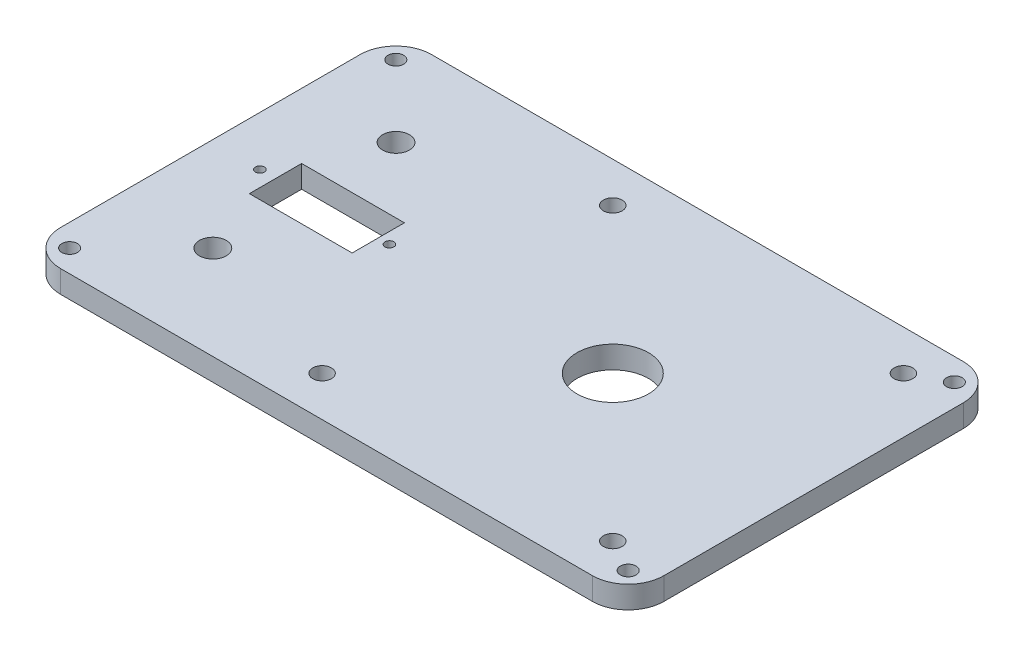
ISO-10303-21;
HEADER;
FILE_DESCRIPTION(('STEP AP214'),'2;1');
FILE_NAME('part.step','',(''),(''),'','','');
FILE_SCHEMA(('AUTOMOTIVE_DESIGN { 1 0 10303 214 1 1 1 1 }'));
ENDSEC;
DATA;
#1=APPLICATION_CONTEXT('core data for automotive mechanical design processes');
#2=APPLICATION_PROTOCOL_DEFINITION('international standard','automotive_design',2000,#1);
#3=PRODUCT_CONTEXT('',#1,'mechanical');
#4=PRODUCT('Part','Part','',(#3));
#5=PRODUCT_RELATED_PRODUCT_CATEGORY('part','',(#4));
#6=PRODUCT_DEFINITION_FORMATION('','',#4);
#7=PRODUCT_DEFINITION_CONTEXT('part definition',#1,'design');
#8=PRODUCT_DEFINITION('design','',#6,#7);
#9=PRODUCT_DEFINITION_SHAPE('','',#8);
#10=(LENGTH_UNIT() NAMED_UNIT(*) SI_UNIT(.MILLI.,.METRE.));
#11=(NAMED_UNIT(*) PLANE_ANGLE_UNIT() SI_UNIT($,.RADIAN.));
#12=(NAMED_UNIT(*) SI_UNIT($,.STERADIAN.) SOLID_ANGLE_UNIT());
#13=UNCERTAINTY_MEASURE_WITH_UNIT(LENGTH_MEASURE(1.E-05),#10,'distance_accuracy_value','');
#14=(GEOMETRIC_REPRESENTATION_CONTEXT(3) GLOBAL_UNCERTAINTY_ASSIGNED_CONTEXT((#13)) GLOBAL_UNIT_ASSIGNED_CONTEXT((#10,
#11,#12)) REPRESENTATION_CONTEXT('',''));
#15=CARTESIAN_POINT('',(0.,0.,0.));
#16=DIRECTION('',(0.,0.,1.));
#17=DIRECTION('',(1.,0.,0.));
#18=AXIS2_PLACEMENT_3D('',#15,#16,#17);
#19=CARTESIAN_POINT('',(-67.5,5.,0.));
#20=DIRECTION('',(-1.,0.,0.));
#21=DIRECTION('',(0.,0.,1.));
#22=AXIS2_PLACEMENT_3D('',#19,#20,#21);
#23=PLANE('',#22);
#24=DIRECTION('',(0.,0.,-1.));
#25=VECTOR('',#24,1.);
#26=CARTESIAN_POINT('',(-67.5,5.,0.));
#27=LINE('',#26,#25);
#28=CARTESIAN_POINT('',(-67.5,5.,33.5));
#29=VERTEX_POINT('',#28);
#30=CARTESIAN_POINT('',(-67.5,5.,-33.5));
#31=VERTEX_POINT('',#30);
#32=EDGE_CURVE('E228',#29,#31,#27,.T.);
#33=ORIENTED_EDGE('',*,*,#32,.T.);
#34=DIRECTION('',(0.,-1.,0.));
#35=VECTOR('',#34,1.);
#36=CARTESIAN_POINT('',(-67.5,0.,-33.5));
#37=LINE('',#36,#35);
#38=CARTESIAN_POINT('',(-67.5,0.,-33.5));
#39=VERTEX_POINT('',#38);
#40=EDGE_CURVE('E353',#31,#39,#37,.T.);
#41=ORIENTED_EDGE('',*,*,#40,.T.);
#42=DIRECTION('',(0.,0.,-1.));
#43=VECTOR('',#42,1.);
#44=CARTESIAN_POINT('',(-67.5,0.,0.));
#45=LINE('',#44,#43);
#46=CARTESIAN_POINT('',(-67.5,0.,33.5));
#47=VERTEX_POINT('',#46);
#48=EDGE_CURVE('E287',#47,#39,#45,.T.);
#49=ORIENTED_EDGE('',*,*,#48,.F.);
#50=DIRECTION('',(0.,-1.,0.));
#51=VECTOR('',#50,1.);
#52=CARTESIAN_POINT('',(-67.5,5.,33.5));
#53=LINE('',#52,#51);
#54=EDGE_CURVE('E350',#47,#29,#53,.F.);
#55=ORIENTED_EDGE('',*,*,#54,.T.);
#56=EDGE_LOOP('',(#33,#41,#49,#55));
#57=FACE_BOUND('',#56,.T.);
#58=ADVANCED_FACE('F44',(#57),#23,.T.);
#59=CARTESIAN_POINT('',(0.,5.,41.5));
#60=DIRECTION('',(0.,0.,1.));
#61=DIRECTION('',(1.,0.,0.));
#62=AXIS2_PLACEMENT_3D('',#59,#60,#61);
#63=PLANE('',#62);
#64=DIRECTION('',(-1.,0.,0.));
#65=VECTOR('',#64,1.);
#66=CARTESIAN_POINT('',(0.,5.,41.5));
#67=LINE('',#66,#65);
#68=CARTESIAN_POINT('',(59.5,5.,41.5));
#69=VERTEX_POINT('',#68);
#70=CARTESIAN_POINT('',(-59.5,5.,41.5));
#71=VERTEX_POINT('',#70);
#72=EDGE_CURVE('E232',#69,#71,#67,.T.);
#73=ORIENTED_EDGE('',*,*,#72,.T.);
#74=DIRECTION('',(0.,-1.,0.));
#75=VECTOR('',#74,1.);
#76=CARTESIAN_POINT('',(-59.5,5.,41.5));
#77=LINE('',#76,#75);
#78=CARTESIAN_POINT('',(-59.5,0.,41.5));
#79=VERTEX_POINT('',#78);
#80=EDGE_CURVE('E11',#71,#79,#77,.T.);
#81=ORIENTED_EDGE('',*,*,#80,.T.);
#82=DIRECTION('',(-1.,0.,0.));
#83=VECTOR('',#82,1.);
#84=CARTESIAN_POINT('',(0.,0.,41.5));
#85=LINE('',#84,#83);
#86=CARTESIAN_POINT('',(59.5,0.,41.5));
#87=VERTEX_POINT('',#86);
#88=EDGE_CURVE('E291',#87,#79,#85,.T.);
#89=ORIENTED_EDGE('',*,*,#88,.F.);
#90=DIRECTION('',(0.,-1.,0.));
#91=VECTOR('',#90,1.);
#92=CARTESIAN_POINT('',(59.5,5.,41.5));
#93=LINE('',#92,#91);
#94=EDGE_CURVE('E53',#87,#69,#93,.F.);
#95=ORIENTED_EDGE('',*,*,#94,.T.);
#96=EDGE_LOOP('',(#73,#81,#89,#95));
#97=FACE_BOUND('',#96,.T.);
#98=ADVANCED_FACE('F369',(#97),#63,.T.);
#99=CARTESIAN_POINT('',(67.5,5.,0.));
#100=DIRECTION('',(-1.,0.,0.));
#101=DIRECTION('',(0.,0.,1.));
#102=AXIS2_PLACEMENT_3D('',#99,#100,#101);
#103=PLANE('',#102);
#104=DIRECTION('',(0.,0.,-1.));
#105=VECTOR('',#104,1.);
#106=CARTESIAN_POINT('',(67.5,0.,0.));
#107=LINE('',#106,#105);
#108=CARTESIAN_POINT('',(67.5,0.,33.5));
#109=VERTEX_POINT('',#108);
#110=CARTESIAN_POINT('',(67.5,0.,-33.5));
#111=VERTEX_POINT('',#110);
#112=EDGE_CURVE('E295',#109,#111,#107,.T.);
#113=ORIENTED_EDGE('',*,*,#112,.T.);
#114=DIRECTION('',(0.,-1.,0.));
#115=VECTOR('',#114,1.);
#116=CARTESIAN_POINT('',(67.5,5.,-33.5));
#117=LINE('',#116,#115);
#118=CARTESIAN_POINT('',(67.5,5.,-33.5));
#119=VERTEX_POINT('',#118);
#120=EDGE_CURVE('E336',#111,#119,#117,.F.);
#121=ORIENTED_EDGE('',*,*,#120,.T.);
#122=DIRECTION('',(0.,0.,-1.));
#123=VECTOR('',#122,1.);
#124=CARTESIAN_POINT('',(67.5,5.,0.));
#125=LINE('',#124,#123);
#126=CARTESIAN_POINT('',(67.5,5.,33.5));
#127=VERTEX_POINT('',#126);
#128=EDGE_CURVE('E235',#127,#119,#125,.T.);
#129=ORIENTED_EDGE('',*,*,#128,.F.);
#130=DIRECTION('',(0.,-1.,0.));
#131=VECTOR('',#130,1.);
#132=CARTESIAN_POINT('',(67.5,0.,33.5));
#133=LINE('',#132,#131);
#134=EDGE_CURVE('E332',#127,#109,#133,.T.);
#135=ORIENTED_EDGE('',*,*,#134,.T.);
#136=EDGE_LOOP('',(#113,#121,#129,#135));
#137=FACE_BOUND('',#136,.T.);
#138=ADVANCED_FACE('F378',(#137),#103,.F.);
#139=CARTESIAN_POINT('',(62.5,5.,36.5));
#140=DIRECTION('',(0.,-1.,0.));
#141=DIRECTION('',(0.,0.,-1.));
#142=AXIS2_PLACEMENT_3D('',#139,#140,#141);
#143=CYLINDRICAL_SURFACE('',#142,1.75);
#144=CARTESIAN_POINT('',(62.5,5.,36.5));
#145=DIRECTION('',(0.,1.,0.));
#146=DIRECTION('',(0.,0.,1.));
#147=AXIS2_PLACEMENT_3D('',#144,#145,#146);
#148=CIRCLE('',#147,1.75);
#149=CARTESIAN_POINT('',(62.5,5.,38.25));
#150=VERTEX_POINT('',#149);
#151=EDGE_CURVE('E247',#150,#150,#148,.T.);
#152=ORIENTED_EDGE('',*,*,#151,.T.);
#153=EDGE_LOOP('',(#152));
#154=FACE_BOUND('',#153,.T.);
#155=CARTESIAN_POINT('',(62.5,0.,36.5));
#156=DIRECTION('',(0.,1.,0.));
#157=DIRECTION('',(0.,0.,1.));
#158=AXIS2_PLACEMENT_3D('',#155,#156,#157);
#159=CIRCLE('',#158,1.75);
#160=CARTESIAN_POINT('',(62.5,0.,38.25));
#161=VERTEX_POINT('',#160);
#162=EDGE_CURVE('E307',#161,#161,#159,.T.);
#163=ORIENTED_EDGE('',*,*,#162,.F.);
#164=EDGE_LOOP('',(#163));
#165=FACE_BOUND('',#164,.T.);
#166=ADVANCED_FACE('F482',(#154,#165),#143,.F.);
#167=CARTESIAN_POINT('',(-46.455,5.,20.5));
#168=DIRECTION('',(0.,-1.,0.));
#169=DIRECTION('',(0.,0.,-1.));
#170=AXIS2_PLACEMENT_3D('',#167,#168,#169);
#171=CYLINDRICAL_SURFACE('',#170,3.00000000000002);
#172=CARTESIAN_POINT('',(-46.455,5.,20.5));
#173=DIRECTION('',(0.,1.,0.));
#174=DIRECTION('',(0.,0.,1.));
#175=AXIS2_PLACEMENT_3D('',#172,#173,#174);
#176=CIRCLE('',#175,3.00000000000002);
#177=CARTESIAN_POINT('',(-46.455,5.,23.5));
#178=VERTEX_POINT('',#177);
#179=EDGE_CURVE('E243',#178,#178,#176,.F.);
#180=ORIENTED_EDGE('',*,*,#179,.F.);
#181=EDGE_LOOP('',(#180));
#182=FACE_BOUND('',#181,.T.);
#183=CARTESIAN_POINT('',(-46.455,0.,20.5));
#184=DIRECTION('',(0.,1.,0.));
#185=DIRECTION('',(0.,0.,1.));
#186=AXIS2_PLACEMENT_3D('',#183,#184,#185);
#187=CIRCLE('',#186,3.00000000000002);
#188=CARTESIAN_POINT('',(-46.455,0.,23.5));
#189=VERTEX_POINT('',#188);
#190=EDGE_CURVE('E303',#189,#189,#187,.F.);
#191=ORIENTED_EDGE('',*,*,#190,.T.);
#192=EDGE_LOOP('',(#191));
#193=FACE_BOUND('',#192,.T.);
#194=ADVANCED_FACE('F485',(#182,#193),#171,.F.);
#195=CARTESIAN_POINT('',(0.,5.,-41.5));
#196=DIRECTION('',(0.,0.,1.));
#197=DIRECTION('',(1.,0.,0.));
#198=AXIS2_PLACEMENT_3D('',#195,#196,#197);
#199=PLANE('',#198);
#200=DIRECTION('',(-1.,0.,0.));
#201=VECTOR('',#200,1.);
#202=CARTESIAN_POINT('',(0.,5.,-41.5));
#203=LINE('',#202,#201);
#204=CARTESIAN_POINT('',(59.5,5.,-41.5));
#205=VERTEX_POINT('',#204);
#206=CARTESIAN_POINT('',(-59.5,5.,-41.5));
#207=VERTEX_POINT('',#206);
#208=EDGE_CURVE('E239',#205,#207,#203,.T.);
#209=ORIENTED_EDGE('',*,*,#208,.F.);
#210=DIRECTION('',(0.,-1.,0.));
#211=VECTOR('',#210,1.);
#212=CARTESIAN_POINT('',(59.5,5.,-41.5));
#213=LINE('',#212,#211);
#214=CARTESIAN_POINT('',(59.5,0.,-41.5));
#215=VERTEX_POINT('',#214);
#216=EDGE_CURVE('E316',#205,#215,#213,.T.);
#217=ORIENTED_EDGE('',*,*,#216,.T.);
#218=DIRECTION('',(-1.,0.,0.));
#219=VECTOR('',#218,1.);
#220=CARTESIAN_POINT('',(0.,0.,-41.5));
#221=LINE('',#220,#219);
#222=CARTESIAN_POINT('',(-59.5,0.,-41.5));
#223=VERTEX_POINT('',#222);
#224=EDGE_CURVE('E299',#215,#223,#221,.T.);
#225=ORIENTED_EDGE('',*,*,#224,.T.);
#226=DIRECTION('',(0.,-1.,0.));
#227=VECTOR('',#226,1.);
#228=CARTESIAN_POINT('',(-59.5,5.,-41.5));
#229=LINE('',#228,#227);
#230=EDGE_CURVE('E255',#223,#207,#229,.F.);
#231=ORIENTED_EDGE('',*,*,#230,.T.);
#232=EDGE_LOOP('',(#209,#217,#225,#231));
#233=FACE_BOUND('',#232,.T.);
#234=ADVANCED_FACE('F386',(#233),#199,.F.);
#235=CARTESIAN_POINT('',(-9.97999999999988,5.,-32.53));
#236=DIRECTION('',(0.,-1.,0.));
#237=DIRECTION('',(0.,0.,-1.));
#238=AXIS2_PLACEMENT_3D('',#235,#236,#237);
#239=CYLINDRICAL_SURFACE('',#238,2.09999999999999);
#240=CARTESIAN_POINT('',(-9.97999999999988,5.,-32.53));
#241=DIRECTION('',(0.,1.,0.));
#242=DIRECTION('',(0.,0.,1.));
#243=AXIS2_PLACEMENT_3D('',#240,#241,#242);
#244=CIRCLE('',#243,2.09999999999999);
#245=CARTESIAN_POINT('',(-9.97999999999988,5.,-30.43));
#246=VERTEX_POINT('',#245);
#247=EDGE_CURVE('E224',#246,#246,#244,.T.);
#248=ORIENTED_EDGE('',*,*,#247,.T.);
#249=EDGE_LOOP('',(#248));
#250=FACE_BOUND('',#249,.T.);
#251=CARTESIAN_POINT('',(-9.97999999999988,0.,-32.53));
#252=DIRECTION('',(0.,1.,0.));
#253=DIRECTION('',(0.,0.,1.));
#254=AXIS2_PLACEMENT_3D('',#251,#252,#253);
#255=CIRCLE('',#254,2.09999999999999);
#256=CARTESIAN_POINT('',(-9.97999999999988,0.,-30.43));
#257=VERTEX_POINT('',#256);
#258=EDGE_CURVE('E283',#257,#257,#255,.T.);
#259=ORIENTED_EDGE('',*,*,#258,.F.);
#260=EDGE_LOOP('',(#259));
#261=FACE_BOUND('',#260,.T.);
#262=ADVANCED_FACE('F406',(#250,#261),#239,.F.);
#263=CARTESIAN_POINT('',(55.0800000000001,5.,-32.53));
#264=DIRECTION('',(0.,-1.,0.));
#265=DIRECTION('',(0.,0.,-1.));
#266=AXIS2_PLACEMENT_3D('',#263,#264,#265);
#267=CYLINDRICAL_SURFACE('',#266,2.1);
#268=CARTESIAN_POINT('',(55.0800000000001,5.,-32.53));
#269=DIRECTION('',(0.,1.,0.));
#270=DIRECTION('',(0.,0.,1.));
#271=AXIS2_PLACEMENT_3D('',#268,#269,#270);
#272=CIRCLE('',#271,2.1);
#273=CARTESIAN_POINT('',(55.0800000000001,5.,-30.43));
#274=VERTEX_POINT('',#273);
#275=EDGE_CURVE('E220',#274,#274,#272,.T.);
#276=ORIENTED_EDGE('',*,*,#275,.T.);
#277=EDGE_LOOP('',(#276));
#278=FACE_BOUND('',#277,.T.);
#279=CARTESIAN_POINT('',(55.0800000000001,0.,-32.53));
#280=DIRECTION('',(0.,1.,0.));
#281=DIRECTION('',(0.,0.,1.));
#282=AXIS2_PLACEMENT_3D('',#279,#280,#281);
#283=CIRCLE('',#282,2.1);
#284=CARTESIAN_POINT('',(55.0800000000001,0.,-30.43));
#285=VERTEX_POINT('',#284);
#286=EDGE_CURVE('E279',#285,#285,#283,.T.);
#287=ORIENTED_EDGE('',*,*,#286,.F.);
#288=EDGE_LOOP('',(#287));
#289=FACE_BOUND('',#288,.T.);
#290=ADVANCED_FACE('F409',(#278,#289),#267,.F.);
#291=CARTESIAN_POINT('',(55.0800000000001,5.,32.53));
#292=DIRECTION('',(0.,-1.,0.));
#293=DIRECTION('',(0.,0.,-1.));
#294=AXIS2_PLACEMENT_3D('',#291,#292,#293);
#295=CYLINDRICAL_SURFACE('',#294,2.1);
#296=CARTESIAN_POINT('',(55.0800000000001,5.,32.53));
#297=DIRECTION('',(0.,1.,0.));
#298=DIRECTION('',(0.,0.,1.));
#299=AXIS2_PLACEMENT_3D('',#296,#297,#298);
#300=CIRCLE('',#299,2.1);
#301=CARTESIAN_POINT('',(55.0800000000001,5.,34.63));
#302=VERTEX_POINT('',#301);
#303=EDGE_CURVE('E216',#302,#302,#300,.T.);
#304=ORIENTED_EDGE('',*,*,#303,.T.);
#305=EDGE_LOOP('',(#304));
#306=FACE_BOUND('',#305,.T.);
#307=CARTESIAN_POINT('',(55.0800000000001,0.,32.53));
#308=DIRECTION('',(0.,1.,0.));
#309=DIRECTION('',(0.,0.,1.));
#310=AXIS2_PLACEMENT_3D('',#307,#308,#309);
#311=CIRCLE('',#310,2.1);
#312=CARTESIAN_POINT('',(55.0800000000001,0.,34.63));
#313=VERTEX_POINT('',#312);
#314=EDGE_CURVE('E275',#313,#313,#311,.T.);
#315=ORIENTED_EDGE('',*,*,#314,.F.);
#316=EDGE_LOOP('',(#315));
#317=FACE_BOUND('',#316,.T.);
#318=ADVANCED_FACE('F413',(#306,#317),#295,.F.);
#319=CARTESIAN_POINT('',(-9.97999999999988,5.,32.53));
#320=DIRECTION('',(0.,-1.,0.));
#321=DIRECTION('',(0.,0.,-1.));
#322=AXIS2_PLACEMENT_3D('',#319,#320,#321);
#323=CYLINDRICAL_SURFACE('',#322,2.09999999999999);
#324=CARTESIAN_POINT('',(-9.97999999999988,5.,32.53));
#325=DIRECTION('',(0.,1.,0.));
#326=DIRECTION('',(0.,0.,1.));
#327=AXIS2_PLACEMENT_3D('',#324,#325,#326);
#328=CIRCLE('',#327,2.09999999999999);
#329=CARTESIAN_POINT('',(-9.97999999999988,5.,34.63));
#330=VERTEX_POINT('',#329);
#331=EDGE_CURVE('E212',#330,#330,#328,.T.);
#332=ORIENTED_EDGE('',*,*,#331,.T.);
#333=EDGE_LOOP('',(#332));
#334=FACE_BOUND('',#333,.T.);
#335=CARTESIAN_POINT('',(-9.97999999999988,0.,32.53));
#336=DIRECTION('',(0.,1.,0.));
#337=DIRECTION('',(0.,0.,1.));
#338=AXIS2_PLACEMENT_3D('',#335,#336,#337);
#339=CIRCLE('',#338,2.09999999999999);
#340=CARTESIAN_POINT('',(-9.97999999999988,0.,34.63));
#341=VERTEX_POINT('',#340);
#342=EDGE_CURVE('E271',#341,#341,#339,.T.);
#343=ORIENTED_EDGE('',*,*,#342,.F.);
#344=EDGE_LOOP('',(#343));
#345=FACE_BOUND('',#344,.T.);
#346=ADVANCED_FACE('F417',(#334,#345),#323,.F.);
#347=CARTESIAN_POINT('',(22.5500000000001,5.,0.));
#348=DIRECTION('',(0.,-1.,0.));
#349=DIRECTION('',(0.,0.,-1.));
#350=AXIS2_PLACEMENT_3D('',#347,#348,#349);
#351=CYLINDRICAL_SURFACE('',#350,8.00000000000001);
#352=CARTESIAN_POINT('',(22.5500000000001,5.,0.));
#353=DIRECTION('',(0.,1.,0.));
#354=DIRECTION('',(0.,0.,1.));
#355=AXIS2_PLACEMENT_3D('',#352,#353,#354);
#356=CIRCLE('',#355,8.00000000000001);
#357=CARTESIAN_POINT('',(22.5500000000001,5.,8.00000000000001));
#358=VERTEX_POINT('',#357);
#359=EDGE_CURVE('E208',#358,#358,#356,.T.);
#360=ORIENTED_EDGE('',*,*,#359,.T.);
#361=EDGE_LOOP('',(#360));
#362=FACE_BOUND('',#361,.T.);
#363=CARTESIAN_POINT('',(22.5500000000001,0.,0.));
#364=DIRECTION('',(0.,1.,0.));
#365=DIRECTION('',(0.,0.,1.));
#366=AXIS2_PLACEMENT_3D('',#363,#364,#365);
#367=CIRCLE('',#366,8.00000000000001);
#368=CARTESIAN_POINT('',(22.5500000000001,0.,8.00000000000001));
#369=VERTEX_POINT('',#368);
#370=EDGE_CURVE('E267',#369,#369,#367,.T.);
#371=ORIENTED_EDGE('',*,*,#370,.F.);
#372=EDGE_LOOP('',(#371));
#373=FACE_BOUND('',#372,.T.);
#374=ADVANCED_FACE('F421',(#362,#373),#351,.F.);
#375=CARTESIAN_POINT('',(-46.455,5.,-20.5));
#376=DIRECTION('',(0.,-1.,0.));
#377=DIRECTION('',(0.,0.,-1.));
#378=AXIS2_PLACEMENT_3D('',#375,#376,#377);
#379=CYLINDRICAL_SURFACE('',#378,3.00000000000002);
#380=CARTESIAN_POINT('',(-46.455,5.,-20.5));
#381=DIRECTION('',(0.,1.,0.));
#382=DIRECTION('',(0.,0.,1.));
#383=AXIS2_PLACEMENT_3D('',#380,#381,#382);
#384=CIRCLE('',#383,3.00000000000002);
#385=CARTESIAN_POINT('',(-46.455,5.,-17.5));
#386=VERTEX_POINT('',#385);
#387=EDGE_CURVE('E204',#386,#386,#384,.T.);
#388=ORIENTED_EDGE('',*,*,#387,.T.);
#389=EDGE_LOOP('',(#388));
#390=FACE_BOUND('',#389,.T.);
#391=CARTESIAN_POINT('',(-46.455,0.,-20.5));
#392=DIRECTION('',(0.,1.,0.));
#393=DIRECTION('',(0.,0.,1.));
#394=AXIS2_PLACEMENT_3D('',#391,#392,#393);
#395=CIRCLE('',#394,3.00000000000002);
#396=CARTESIAN_POINT('',(-46.455,0.,-17.5));
#397=VERTEX_POINT('',#396);
#398=EDGE_CURVE('E263',#397,#397,#395,.T.);
#399=ORIENTED_EDGE('',*,*,#398,.F.);
#400=EDGE_LOOP('',(#399));
#401=FACE_BOUND('',#400,.T.);
#402=ADVANCED_FACE('F425',(#390,#401),#379,.F.);
#403=CARTESIAN_POINT('',(-62.5,5.,-36.5));
#404=DIRECTION('',(0.,-1.,0.));
#405=DIRECTION('',(0.,0.,-1.));
#406=AXIS2_PLACEMENT_3D('',#403,#404,#405);
#407=CYLINDRICAL_SURFACE('',#406,1.75);
#408=CARTESIAN_POINT('',(-62.5,5.,-36.5));
#409=DIRECTION('',(0.,1.,0.));
#410=DIRECTION('',(0.,0.,1.));
#411=AXIS2_PLACEMENT_3D('',#408,#409,#410);
#412=CIRCLE('',#411,1.75);
#413=CARTESIAN_POINT('',(-62.5,5.,-34.75));
#414=VERTEX_POINT('',#413);
#415=EDGE_CURVE('E199',#414,#414,#412,.T.);
#416=ORIENTED_EDGE('',*,*,#415,.T.);
#417=EDGE_LOOP('',(#416));
#418=FACE_BOUND('',#417,.T.);
#419=CARTESIAN_POINT('',(-62.5,0.,-36.5));
#420=DIRECTION('',(0.,1.,0.));
#421=DIRECTION('',(0.,0.,1.));
#422=AXIS2_PLACEMENT_3D('',#419,#420,#421);
#423=CIRCLE('',#422,1.75);
#424=CARTESIAN_POINT('',(-62.5,0.,-34.75));
#425=VERTEX_POINT('',#424);
#426=EDGE_CURVE('E259',#425,#425,#423,.T.);
#427=ORIENTED_EDGE('',*,*,#426,.F.);
#428=EDGE_LOOP('',(#427));
#429=FACE_BOUND('',#428,.T.);
#430=ADVANCED_FACE('F429',(#418,#429),#407,.F.);
#431=CARTESIAN_POINT('',(62.5,5.,-36.5));
#432=DIRECTION('',(0.,-1.,0.));
#433=DIRECTION('',(0.,0.,-1.));
#434=AXIS2_PLACEMENT_3D('',#431,#432,#433);
#435=CYLINDRICAL_SURFACE('',#434,1.75);
#436=CARTESIAN_POINT('',(62.5,5.,-36.5));
#437=DIRECTION('',(0.,1.,0.));
#438=DIRECTION('',(0.,0.,1.));
#439=AXIS2_PLACEMENT_3D('',#436,#437,#438);
#440=CIRCLE('',#439,1.75);
#441=CARTESIAN_POINT('',(62.5,5.,-34.75));
#442=VERTEX_POINT('',#441);
#443=EDGE_CURVE('E195',#442,#442,#440,.F.);
#444=ORIENTED_EDGE('',*,*,#443,.F.);
#445=EDGE_LOOP('',(#444));
#446=FACE_BOUND('',#445,.T.);
#447=CARTESIAN_POINT('',(62.5,0.,-36.5));
#448=DIRECTION('',(0.,1.,0.));
#449=DIRECTION('',(0.,0.,1.));
#450=AXIS2_PLACEMENT_3D('',#447,#448,#449);
#451=CIRCLE('',#450,1.75);
#452=CARTESIAN_POINT('',(62.5,0.,-34.75));
#453=VERTEX_POINT('',#452);
#454=EDGE_CURVE('E189',#453,#453,#451,.F.);
#455=ORIENTED_EDGE('',*,*,#454,.T.);
#456=EDGE_LOOP('',(#455));
#457=FACE_BOUND('',#456,.T.);
#458=ADVANCED_FACE('F433',(#446,#457),#435,.F.);
#459=CARTESIAN_POINT('',(-62.5,5.,36.5));
#460=DIRECTION('',(0.,-1.,0.));
#461=DIRECTION('',(0.,0.,-1.));
#462=AXIS2_PLACEMENT_3D('',#459,#460,#461);
#463=CYLINDRICAL_SURFACE('',#462,1.75);
#464=CARTESIAN_POINT('',(-62.5,5.,36.5));
#465=DIRECTION('',(0.,1.,0.));
#466=DIRECTION('',(0.,0.,1.));
#467=AXIS2_PLACEMENT_3D('',#464,#465,#466);
#468=CIRCLE('',#467,1.75);
#469=CARTESIAN_POINT('',(-62.5,5.,38.25));
#470=VERTEX_POINT('',#469);
#471=EDGE_CURVE('E251',#470,#470,#468,.F.);
#472=ORIENTED_EDGE('',*,*,#471,.F.);
#473=EDGE_LOOP('',(#472));
#474=FACE_BOUND('',#473,.T.);
#475=CARTESIAN_POINT('',(-62.5,0.,36.5));
#476=DIRECTION('',(0.,1.,0.));
#477=DIRECTION('',(0.,0.,1.));
#478=AXIS2_PLACEMENT_3D('',#475,#476,#477);
#479=CIRCLE('',#478,1.75);
#480=CARTESIAN_POINT('',(-62.5,0.,38.25));
#481=VERTEX_POINT('',#480);
#482=EDGE_CURVE('E200',#481,#481,#479,.F.);
#483=ORIENTED_EDGE('',*,*,#482,.T.);
#484=EDGE_LOOP('',(#483));
#485=FACE_BOUND('',#484,.T.);
#486=ADVANCED_FACE('F436',(#474,#485),#463,.F.);
#487=CARTESIAN_POINT('',(0.,5.,0.));
#488=DIRECTION('',(0.,1.,0.));
#489=DIRECTION('',(0.,0.,1.));
#490=AXIS2_PLACEMENT_3D('',#487,#488,#489);
#491=PLANE('',#490);
#492=CARTESIAN_POINT('',(-56.43,5.,0.));
#493=DIRECTION('',(0.,1.,0.));
#494=DIRECTION('',(0.,0.,1.));
#495=AXIS2_PLACEMENT_3D('',#492,#493,#494);
#496=CIRCLE('',#495,0.999999999999998);
#497=CARTESIAN_POINT('',(-56.43,5.,0.999999999999999));
#498=VERTEX_POINT('',#497);
#499=EDGE_CURVE('E719',#498,#498,#496,.T.);
#500=ORIENTED_EDGE('',*,*,#499,.F.);
#501=EDGE_LOOP('',(#500));
#502=FACE_BOUND('',#501,.T.);
#503=CARTESIAN_POINT('',(-27.43,5.,0.));
#504=DIRECTION('',(0.,1.,0.));
#505=DIRECTION('',(0.,0.,1.));
#506=AXIS2_PLACEMENT_3D('',#503,#504,#505);
#507=CIRCLE('',#506,1.);
#508=CARTESIAN_POINT('',(-27.43,5.,1.));
#509=VERTEX_POINT('',#508);
#510=EDGE_CURVE('E180',#509,#509,#507,.T.);
#511=ORIENTED_EDGE('',*,*,#510,.F.);
#512=EDGE_LOOP('',(#511));
#513=FACE_BOUND('',#512,.T.);
#514=DIRECTION('',(0.,0.,-1.));
#515=VECTOR('',#514,1.);
#516=CARTESIAN_POINT('',(-29.93,5.,5.85));
#517=LINE('',#516,#515);
#518=CARTESIAN_POINT('',(-29.93,5.,5.85));
#519=VERTEX_POINT('',#518);
#520=CARTESIAN_POINT('',(-29.93,5.,-5.85));
#521=VERTEX_POINT('',#520);
#522=EDGE_CURVE('E142',#519,#521,#517,.T.);
#523=ORIENTED_EDGE('',*,*,#522,.F.);
#524=DIRECTION('',(1.,0.,0.));
#525=VECTOR('',#524,1.);
#526=CARTESIAN_POINT('',(-29.93,5.,5.85));
#527=LINE('',#526,#525);
#528=CARTESIAN_POINT('',(-52.93,5.,5.85));
#529=VERTEX_POINT('',#528);
#530=EDGE_CURVE('E163',#529,#519,#527,.T.);
#531=ORIENTED_EDGE('',*,*,#530,.F.);
#532=DIRECTION('',(0.,0.,1.));
#533=VECTOR('',#532,1.);
#534=CARTESIAN_POINT('',(-52.93,5.,5.85));
#535=LINE('',#534,#533);
#536=CARTESIAN_POINT('',(-52.93,5.,-5.85));
#537=VERTEX_POINT('',#536);
#538=EDGE_CURVE('E167',#537,#529,#535,.T.);
#539=ORIENTED_EDGE('',*,*,#538,.F.);
#540=DIRECTION('',(-1.,0.,0.));
#541=VECTOR('',#540,1.);
#542=CARTESIAN_POINT('',(-29.93,5.,-5.85));
#543=LINE('',#542,#541);
#544=EDGE_CURVE('E179',#521,#537,#543,.T.);
#545=ORIENTED_EDGE('',*,*,#544,.F.);
#546=EDGE_LOOP('',(#523,#531,#539,#545));
#547=FACE_BOUND('',#546,.T.);
#548=ORIENTED_EDGE('',*,*,#443,.T.);
#549=EDGE_LOOP('',(#548));
#550=FACE_BOUND('',#549,.T.);
#551=ORIENTED_EDGE('',*,*,#415,.F.);
#552=EDGE_LOOP('',(#551));
#553=FACE_BOUND('',#552,.T.);
#554=ORIENTED_EDGE('',*,*,#387,.F.);
#555=EDGE_LOOP('',(#554));
#556=FACE_BOUND('',#555,.T.);
#557=ORIENTED_EDGE('',*,*,#359,.F.);
#558=EDGE_LOOP('',(#557));
#559=FACE_BOUND('',#558,.T.);
#560=ORIENTED_EDGE('',*,*,#331,.F.);
#561=EDGE_LOOP('',(#560));
#562=FACE_BOUND('',#561,.T.);
#563=ORIENTED_EDGE('',*,*,#303,.F.);
#564=EDGE_LOOP('',(#563));
#565=FACE_BOUND('',#564,.T.);
#566=ORIENTED_EDGE('',*,*,#275,.F.);
#567=EDGE_LOOP('',(#566));
#568=FACE_BOUND('',#567,.T.);
#569=ORIENTED_EDGE('',*,*,#247,.F.);
#570=EDGE_LOOP('',(#569));
#571=FACE_BOUND('',#570,.T.);
#572=ORIENTED_EDGE('',*,*,#128,.T.);
#573=CARTESIAN_POINT('',(59.5,5.,-33.5));
#574=DIRECTION('',(0.,1.,0.));
#575=DIRECTION('',(0.,0.,1.));
#576=AXIS2_PLACEMENT_3D('',#573,#574,#575);
#577=CIRCLE('',#576,8.);
#578=EDGE_CURVE('E347',#119,#205,#577,.T.);
#579=ORIENTED_EDGE('',*,*,#578,.T.);
#580=ORIENTED_EDGE('',*,*,#208,.T.);
#581=CARTESIAN_POINT('',(-59.5,5.,-33.5));
#582=DIRECTION('',(0.,1.,0.));
#583=DIRECTION('',(0.,0.,1.));
#584=AXIS2_PLACEMENT_3D('',#581,#582,#583);
#585=CIRCLE('',#584,8.);
#586=EDGE_CURVE('E344',#207,#31,#585,.T.);
#587=ORIENTED_EDGE('',*,*,#586,.T.);
#588=ORIENTED_EDGE('',*,*,#32,.F.);
#589=CARTESIAN_POINT('',(-59.5,5.,33.5));
#590=DIRECTION('',(0.,1.,0.));
#591=DIRECTION('',(0.,0.,1.));
#592=AXIS2_PLACEMENT_3D('',#589,#590,#591);
#593=CIRCLE('',#592,8.);
#594=EDGE_CURVE('E60',#29,#71,#593,.T.);
#595=ORIENTED_EDGE('',*,*,#594,.T.);
#596=ORIENTED_EDGE('',*,*,#72,.F.);
#597=CARTESIAN_POINT('',(59.5,5.,33.5));
#598=DIRECTION('',(0.,1.,0.));
#599=DIRECTION('',(0.,0.,1.));
#600=AXIS2_PLACEMENT_3D('',#597,#598,#599);
#601=CIRCLE('',#600,8.);
#602=EDGE_CURVE('E339',#69,#127,#601,.T.);
#603=ORIENTED_EDGE('',*,*,#602,.T.);
#604=EDGE_LOOP('',(#572,#579,#580,#587,#588,#595,#596,#603));
#605=FACE_BOUND('',#604,.T.);
#606=ORIENTED_EDGE('',*,*,#179,.T.);
#607=EDGE_LOOP('',(#606));
#608=FACE_BOUND('',#607,.T.);
#609=ORIENTED_EDGE('',*,*,#151,.F.);
#610=EDGE_LOOP('',(#609));
#611=FACE_BOUND('',#610,.T.);
#612=ORIENTED_EDGE('',*,*,#471,.T.);
#613=EDGE_LOOP('',(#612));
#614=FACE_BOUND('',#613,.T.);
#615=ADVANCED_FACE('F371',(#502,#513,#547,#550,#553,#556,#559,#562,#565,#568,#571,#605,#608,
#611,#614),#491,.T.);
#616=CARTESIAN_POINT('',(0.,0.,0.));
#617=DIRECTION('',(0.,1.,0.));
#618=DIRECTION('',(0.,0.,1.));
#619=AXIS2_PLACEMENT_3D('',#616,#617,#618);
#620=PLANE('',#619);
#621=CARTESIAN_POINT('',(-56.43,0.,0.));
#622=DIRECTION('',(0.,1.,0.));
#623=DIRECTION('',(0.,0.,1.));
#624=AXIS2_PLACEMENT_3D('',#621,#622,#623);
#625=CIRCLE('',#624,0.999999999999998);
#626=CARTESIAN_POINT('',(-56.43,0.,0.999999999999999));
#627=VERTEX_POINT('',#626);
#628=EDGE_CURVE('E170',#627,#627,#625,.T.);
#629=ORIENTED_EDGE('',*,*,#628,.T.);
#630=EDGE_LOOP('',(#629));
#631=FACE_BOUND('',#630,.T.);
#632=CARTESIAN_POINT('',(-27.43,0.,0.));
#633=DIRECTION('',(0.,1.,0.));
#634=DIRECTION('',(0.,0.,1.));
#635=AXIS2_PLACEMENT_3D('',#632,#633,#634);
#636=CIRCLE('',#635,1.);
#637=CARTESIAN_POINT('',(-27.43,0.,1.));
#638=VERTEX_POINT('',#637);
#639=EDGE_CURVE('E721',#638,#638,#636,.T.);
#640=ORIENTED_EDGE('',*,*,#639,.T.);
#641=EDGE_LOOP('',(#640));
#642=FACE_BOUND('',#641,.T.);
#643=DIRECTION('',(1.,0.,0.));
#644=VECTOR('',#643,1.);
#645=CARTESIAN_POINT('',(-29.93,0.,5.85));
#646=LINE('',#645,#644);
#647=CARTESIAN_POINT('',(-52.93,0.,5.85));
#648=VERTEX_POINT('',#647);
#649=CARTESIAN_POINT('',(-29.93,0.,5.85));
#650=VERTEX_POINT('',#649);
#651=EDGE_CURVE('E148',#648,#650,#646,.T.);
#652=ORIENTED_EDGE('',*,*,#651,.T.);
#653=DIRECTION('',(0.,0.,-1.));
#654=VECTOR('',#653,1.);
#655=CARTESIAN_POINT('',(-29.93,0.,5.85));
#656=LINE('',#655,#654);
#657=CARTESIAN_POINT('',(-29.93,0.,-5.85));
#658=VERTEX_POINT('',#657);
#659=EDGE_CURVE('E139',#650,#658,#656,.T.);
#660=ORIENTED_EDGE('',*,*,#659,.T.);
#661=DIRECTION('',(-1.,0.,0.));
#662=VECTOR('',#661,1.);
#663=CARTESIAN_POINT('',(-29.93,0.,-5.85));
#664=LINE('',#663,#662);
#665=CARTESIAN_POINT('',(-52.93,0.,-5.85));
#666=VERTEX_POINT('',#665);
#667=EDGE_CURVE('E152',#658,#666,#664,.T.);
#668=ORIENTED_EDGE('',*,*,#667,.T.);
#669=DIRECTION('',(0.,0.,1.));
#670=VECTOR('',#669,1.);
#671=CARTESIAN_POINT('',(-52.93,0.,5.85));
#672=LINE('',#671,#670);
#673=EDGE_CURVE('E157',#666,#648,#672,.T.);
#674=ORIENTED_EDGE('',*,*,#673,.T.);
#675=EDGE_LOOP('',(#652,#660,#668,#674));
#676=FACE_BOUND('',#675,.T.);
#677=ORIENTED_EDGE('',*,*,#454,.F.);
#678=EDGE_LOOP('',(#677));
#679=FACE_BOUND('',#678,.T.);
#680=ORIENTED_EDGE('',*,*,#426,.T.);
#681=EDGE_LOOP('',(#680));
#682=FACE_BOUND('',#681,.T.);
#683=ORIENTED_EDGE('',*,*,#398,.T.);
#684=EDGE_LOOP('',(#683));
#685=FACE_BOUND('',#684,.T.);
#686=ORIENTED_EDGE('',*,*,#370,.T.);
#687=EDGE_LOOP('',(#686));
#688=FACE_BOUND('',#687,.T.);
#689=ORIENTED_EDGE('',*,*,#342,.T.);
#690=EDGE_LOOP('',(#689));
#691=FACE_BOUND('',#690,.T.);
#692=ORIENTED_EDGE('',*,*,#314,.T.);
#693=EDGE_LOOP('',(#692));
#694=FACE_BOUND('',#693,.T.);
#695=ORIENTED_EDGE('',*,*,#286,.T.);
#696=EDGE_LOOP('',(#695));
#697=FACE_BOUND('',#696,.T.);
#698=ORIENTED_EDGE('',*,*,#258,.T.);
#699=EDGE_LOOP('',(#698));
#700=FACE_BOUND('',#699,.T.);
#701=ORIENTED_EDGE('',*,*,#224,.F.);
#702=CARTESIAN_POINT('',(59.5,0.,-33.5));
#703=DIRECTION('',(0.,1.,0.));
#704=DIRECTION('',(0.,0.,1.));
#705=AXIS2_PLACEMENT_3D('',#702,#703,#704);
#706=CIRCLE('',#705,8.);
#707=EDGE_CURVE('E329',#215,#111,#706,.F.);
#708=ORIENTED_EDGE('',*,*,#707,.T.);
#709=ORIENTED_EDGE('',*,*,#112,.F.);
#710=CARTESIAN_POINT('',(59.5,0.,33.5));
#711=DIRECTION('',(0.,1.,0.));
#712=DIRECTION('',(0.,0.,1.));
#713=AXIS2_PLACEMENT_3D('',#710,#711,#712);
#714=CIRCLE('',#713,8.);
#715=EDGE_CURVE('E320',#109,#87,#714,.F.);
#716=ORIENTED_EDGE('',*,*,#715,.T.);
#717=ORIENTED_EDGE('',*,*,#88,.T.);
#718=CARTESIAN_POINT('',(-59.5,0.,33.5));
#719=DIRECTION('',(0.,1.,0.));
#720=DIRECTION('',(0.,0.,1.));
#721=AXIS2_PLACEMENT_3D('',#718,#719,#720);
#722=CIRCLE('',#721,8.);
#723=EDGE_CURVE('E323',#79,#47,#722,.F.);
#724=ORIENTED_EDGE('',*,*,#723,.T.);
#725=ORIENTED_EDGE('',*,*,#48,.T.);
#726=CARTESIAN_POINT('',(-59.5,0.,-33.5));
#727=DIRECTION('',(0.,1.,0.));
#728=DIRECTION('',(0.,0.,1.));
#729=AXIS2_PLACEMENT_3D('',#726,#727,#728);
#730=CIRCLE('',#729,8.);
#731=EDGE_CURVE('E326',#39,#223,#730,.F.);
#732=ORIENTED_EDGE('',*,*,#731,.T.);
#733=EDGE_LOOP('',(#701,#708,#709,#716,#717,#724,#725,#732));
#734=FACE_BOUND('',#733,.T.);
#735=ORIENTED_EDGE('',*,*,#190,.F.);
#736=EDGE_LOOP('',(#735));
#737=FACE_BOUND('',#736,.T.);
#738=ORIENTED_EDGE('',*,*,#162,.T.);
#739=EDGE_LOOP('',(#738));
#740=FACE_BOUND('',#739,.T.);
#741=ORIENTED_EDGE('',*,*,#482,.F.);
#742=EDGE_LOOP('',(#741));
#743=FACE_BOUND('',#742,.T.);
#744=ADVANCED_FACE('F159',(#631,#642,#676,#679,#682,#685,#688,#691,#694,#697,#700,#734,#737,
#740,#743),#620,.F.);
#745=CARTESIAN_POINT('',(-29.93,0.,5.85));
#746=DIRECTION('',(1.,0.,0.));
#747=DIRECTION('',(0.,0.,-1.));
#748=AXIS2_PLACEMENT_3D('',#745,#746,#747);
#749=PLANE('',#748);
#750=ORIENTED_EDGE('',*,*,#522,.T.);
#751=DIRECTION('',(0.,1.,0.));
#752=VECTOR('',#751,1.);
#753=CARTESIAN_POINT('',(-29.93,0.,-5.85));
#754=LINE('',#753,#752);
#755=EDGE_CURVE('E135',#658,#521,#754,.T.);
#756=ORIENTED_EDGE('',*,*,#755,.F.);
#757=ORIENTED_EDGE('',*,*,#659,.F.);
#758=DIRECTION('',(0.,1.,0.));
#759=VECTOR('',#758,1.);
#760=CARTESIAN_POINT('',(-29.93,0.,5.85));
#761=LINE('',#760,#759);
#762=EDGE_CURVE('E186',#650,#519,#761,.T.);
#763=ORIENTED_EDGE('',*,*,#762,.T.);
#764=EDGE_LOOP('',(#750,#756,#757,#763));
#765=FACE_BOUND('',#764,.T.);
#766=ADVANCED_FACE('F137',(#765),#749,.F.);
#767=CARTESIAN_POINT('',(-29.93,0.,5.85));
#768=DIRECTION('',(0.,0.,1.));
#769=DIRECTION('',(1.,0.,0.));
#770=AXIS2_PLACEMENT_3D('',#767,#768,#769);
#771=PLANE('',#770);
#772=ORIENTED_EDGE('',*,*,#530,.T.);
#773=ORIENTED_EDGE('',*,*,#762,.F.);
#774=ORIENTED_EDGE('',*,*,#651,.F.);
#775=DIRECTION('',(0.,1.,0.));
#776=VECTOR('',#775,1.);
#777=CARTESIAN_POINT('',(-52.93,0.,5.85));
#778=LINE('',#777,#776);
#779=EDGE_CURVE('E190',#648,#529,#778,.T.);
#780=ORIENTED_EDGE('',*,*,#779,.T.);
#781=EDGE_LOOP('',(#772,#773,#774,#780));
#782=FACE_BOUND('',#781,.T.);
#783=ADVANCED_FACE('F475',(#782),#771,.F.);
#784=CARTESIAN_POINT('',(-52.93,0.,5.85));
#785=DIRECTION('',(-1.,0.,0.));
#786=DIRECTION('',(0.,0.,1.));
#787=AXIS2_PLACEMENT_3D('',#784,#785,#786);
#788=PLANE('',#787);
#789=ORIENTED_EDGE('',*,*,#538,.T.);
#790=ORIENTED_EDGE('',*,*,#779,.F.);
#791=ORIENTED_EDGE('',*,*,#673,.F.);
#792=DIRECTION('',(0.,1.,0.));
#793=VECTOR('',#792,1.);
#794=CARTESIAN_POINT('',(-52.93,0.,-5.85));
#795=LINE('',#794,#793);
#796=EDGE_CURVE('E147',#666,#537,#795,.T.);
#797=ORIENTED_EDGE('',*,*,#796,.T.);
#798=EDGE_LOOP('',(#789,#790,#791,#797));
#799=FACE_BOUND('',#798,.T.);
#800=ADVANCED_FACE('F525',(#799),#788,.F.);
#801=CARTESIAN_POINT('',(-29.93,0.,-5.85));
#802=DIRECTION('',(0.,0.,-1.));
#803=DIRECTION('',(-1.,0.,0.));
#804=AXIS2_PLACEMENT_3D('',#801,#802,#803);
#805=PLANE('',#804);
#806=ORIENTED_EDGE('',*,*,#544,.T.);
#807=ORIENTED_EDGE('',*,*,#796,.F.);
#808=ORIENTED_EDGE('',*,*,#667,.F.);
#809=ORIENTED_EDGE('',*,*,#755,.T.);
#810=EDGE_LOOP('',(#806,#807,#808,#809));
#811=FACE_BOUND('',#810,.T.);
#812=ADVANCED_FACE('F153',(#811),#805,.F.);
#813=CARTESIAN_POINT('',(-27.43,0.,0.));
#814=DIRECTION('',(0.,1.,0.));
#815=DIRECTION('',(0.,0.,1.));
#816=AXIS2_PLACEMENT_3D('',#813,#814,#815);
#817=CYLINDRICAL_SURFACE('',#816,1.);
#818=ORIENTED_EDGE('',*,*,#639,.F.);
#819=EDGE_LOOP('',(#818));
#820=FACE_BOUND('',#819,.T.);
#821=ORIENTED_EDGE('',*,*,#510,.T.);
#822=EDGE_LOOP('',(#821));
#823=FACE_BOUND('',#822,.T.);
#824=ADVANCED_FACE('F540',(#820,#823),#817,.F.);
#825=CARTESIAN_POINT('',(-56.43,0.,0.));
#826=DIRECTION('',(0.,1.,0.));
#827=DIRECTION('',(0.,0.,1.));
#828=AXIS2_PLACEMENT_3D('',#825,#826,#827);
#829=CYLINDRICAL_SURFACE('',#828,0.999999999999998);
#830=ORIENTED_EDGE('',*,*,#628,.F.);
#831=EDGE_LOOP('',(#830));
#832=FACE_BOUND('',#831,.T.);
#833=ORIENTED_EDGE('',*,*,#499,.T.);
#834=EDGE_LOOP('',(#833));
#835=FACE_BOUND('',#834,.T.);
#836=ADVANCED_FACE('F395',(#832,#835),#829,.F.);
#837=CARTESIAN_POINT('',(59.5,5.,-33.5));
#838=DIRECTION('',(0.,-1.,0.));
#839=DIRECTION('',(0.,0.,-1.));
#840=AXIS2_PLACEMENT_3D('',#837,#838,#839);
#841=CYLINDRICAL_SURFACE('',#840,8.);
#842=ORIENTED_EDGE('',*,*,#578,.F.);
#843=ORIENTED_EDGE('',*,*,#120,.F.);
#844=ORIENTED_EDGE('',*,*,#707,.F.);
#845=ORIENTED_EDGE('',*,*,#216,.F.);
#846=EDGE_LOOP('',(#842,#843,#844,#845));
#847=FACE_BOUND('',#846,.T.);
#848=ADVANCED_FACE('F383',(#847),#841,.T.);
#849=CARTESIAN_POINT('',(-59.5,5.,-33.5));
#850=DIRECTION('',(0.,1.,0.));
#851=DIRECTION('',(0.,0.,1.));
#852=AXIS2_PLACEMENT_3D('',#849,#850,#851);
#853=CYLINDRICAL_SURFACE('',#852,8.);
#854=ORIENTED_EDGE('',*,*,#586,.F.);
#855=ORIENTED_EDGE('',*,*,#230,.F.);
#856=ORIENTED_EDGE('',*,*,#731,.F.);
#857=ORIENTED_EDGE('',*,*,#40,.F.);
#858=EDGE_LOOP('',(#854,#855,#856,#857));
#859=FACE_BOUND('',#858,.T.);
#860=ADVANCED_FACE('F388',(#859),#853,.T.);
#861=CARTESIAN_POINT('',(-59.5,5.,33.5));
#862=DIRECTION('',(0.,-1.,0.));
#863=DIRECTION('',(0.,0.,-1.));
#864=AXIS2_PLACEMENT_3D('',#861,#862,#863);
#865=CYLINDRICAL_SURFACE('',#864,8.);
#866=ORIENTED_EDGE('',*,*,#594,.F.);
#867=ORIENTED_EDGE('',*,*,#54,.F.);
#868=ORIENTED_EDGE('',*,*,#723,.F.);
#869=ORIENTED_EDGE('',*,*,#80,.F.);
#870=EDGE_LOOP('',(#866,#867,#868,#869));
#871=FACE_BOUND('',#870,.T.);
#872=ADVANCED_FACE('F368',(#871),#865,.T.);
#873=CARTESIAN_POINT('',(59.5,5.,33.5));
#874=DIRECTION('',(0.,1.,0.));
#875=DIRECTION('',(0.,0.,1.));
#876=AXIS2_PLACEMENT_3D('',#873,#874,#875);
#877=CYLINDRICAL_SURFACE('',#876,8.);
#878=ORIENTED_EDGE('',*,*,#602,.F.);
#879=ORIENTED_EDGE('',*,*,#94,.F.);
#880=ORIENTED_EDGE('',*,*,#715,.F.);
#881=ORIENTED_EDGE('',*,*,#134,.F.);
#882=EDGE_LOOP('',(#878,#879,#880,#881));
#883=FACE_BOUND('',#882,.T.);
#884=ADVANCED_FACE('F46',(#883),#877,.T.);
#885=CLOSED_SHELL('',(#58,#98,#138,#166,#194,#234,#262,#290,#318,#346,#374,#402,#430,#458,#486,
#615,#744,#766,#783,#800,#812,#824,#836,#848,#860,#872,#884));
#886=MANIFOLD_SOLID_BREP('B2',#885);
#887=ADVANCED_BREP_SHAPE_REPRESENTATION('',(#18,#886),#14);
#888=SHAPE_DEFINITION_REPRESENTATION(#9,#887);
ENDSEC;
END-ISO-10303-21;
